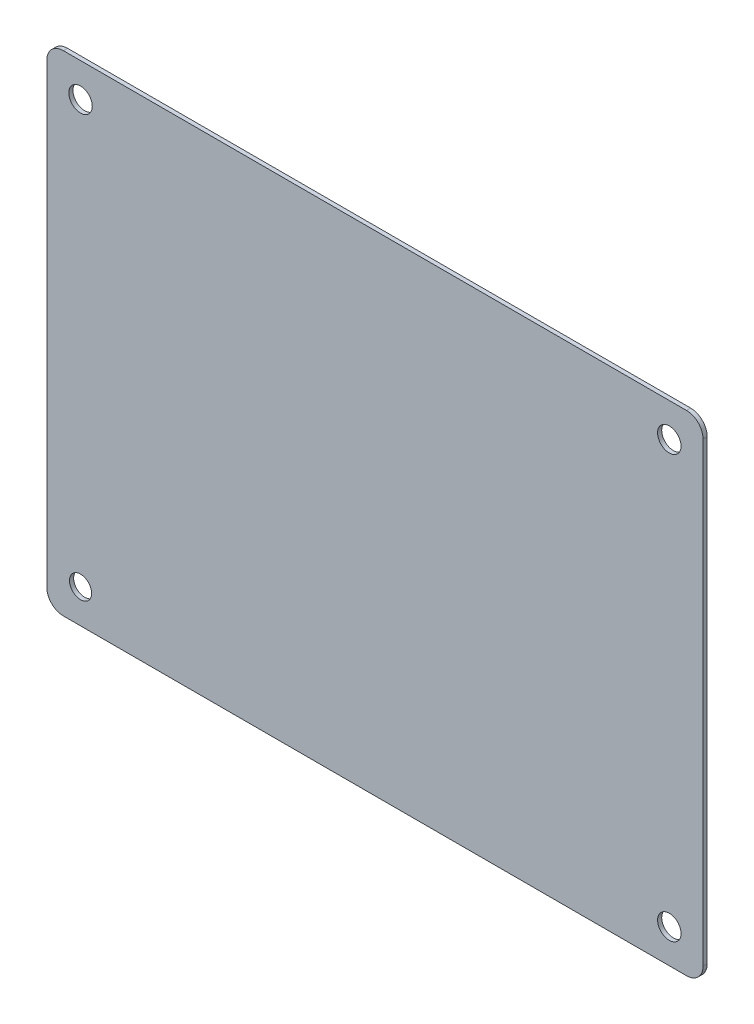
ISO-10303-21;
HEADER;
FILE_DESCRIPTION(('STEP AP214'),'2;1');
FILE_NAME('part.step','',(''),(''),'','','');
FILE_SCHEMA(('AUTOMOTIVE_DESIGN { 1 0 10303 214 1 1 1 1 }'));
ENDSEC;
DATA;
#1=APPLICATION_CONTEXT('core data for automotive mechanical design processes');
#2=APPLICATION_PROTOCOL_DEFINITION('international standard','automotive_design',2000,#1);
#3=PRODUCT_CONTEXT('',#1,'mechanical');
#4=PRODUCT('Part','Part','',(#3));
#5=PRODUCT_RELATED_PRODUCT_CATEGORY('part','',(#4));
#6=PRODUCT_DEFINITION_FORMATION('','',#4);
#7=PRODUCT_DEFINITION_CONTEXT('part definition',#1,'design');
#8=PRODUCT_DEFINITION('design','',#6,#7);
#9=PRODUCT_DEFINITION_SHAPE('','',#8);
#10=(LENGTH_UNIT() NAMED_UNIT(*) SI_UNIT(.MILLI.,.METRE.));
#11=(NAMED_UNIT(*) PLANE_ANGLE_UNIT() SI_UNIT($,.RADIAN.));
#12=(NAMED_UNIT(*) SI_UNIT($,.STERADIAN.) SOLID_ANGLE_UNIT());
#13=UNCERTAINTY_MEASURE_WITH_UNIT(LENGTH_MEASURE(1.E-05),#10,'distance_accuracy_value','');
#14=(GEOMETRIC_REPRESENTATION_CONTEXT(3) GLOBAL_UNCERTAINTY_ASSIGNED_CONTEXT((#13)) GLOBAL_UNIT_ASSIGNED_CONTEXT((#10,
#11,#12)) REPRESENTATION_CONTEXT('',''));
#15=CARTESIAN_POINT('',(0.,0.,0.));
#16=DIRECTION('',(0.,0.,1.));
#17=DIRECTION('',(1.,0.,0.));
#18=AXIS2_PLACEMENT_3D('',#15,#16,#17);
#19=CARTESIAN_POINT('',(403.918477617986,1244.64155346518,1.5875));
#20=DIRECTION('',(0.,0.,-1.));
#21=DIRECTION('',(-1.,0.,0.));
#22=AXIS2_PLACEMENT_3D('',#19,#20,#21);
#23=PLANE('',#22);
#24=CARTESIAN_POINT('',(403.918477617986,1244.64155346518,1.5875));
#25=DIRECTION('',(0.,0.,1.));
#26=DIRECTION('',(-1.,0.,0.));
#27=AXIS2_PLACEMENT_3D('',#24,#25,#26);
#28=CIRCLE('',#27,6.35000000000005);
#29=CARTESIAN_POINT('',(397.568477617986,1244.64155346518,1.5875));
#30=VERTEX_POINT('',#29);
#31=CARTESIAN_POINT('',(403.918477617986,1238.29155346518,1.5875));
#32=VERTEX_POINT('',#31);
#33=EDGE_CURVE('E170',#30,#32,#28,.T.);
#34=ORIENTED_EDGE('',*,*,#33,.T.);
#35=DIRECTION('',(1.,0.,0.));
#36=VECTOR('',#35,1.);
#37=CARTESIAN_POINT('',(403.918477617986,1238.29155346518,1.5875));
#38=LINE('',#37,#36);
#39=CARTESIAN_POINT('',(643.139919853278,1238.29155346518,1.5875));
#40=VERTEX_POINT('',#39);
#41=EDGE_CURVE('E106',#32,#40,#38,.T.);
#42=ORIENTED_EDGE('',*,*,#41,.T.);
#43=CARTESIAN_POINT('',(643.139919853278,1244.64155346518,1.5875));
#44=DIRECTION('',(0.,0.,1.));
#45=DIRECTION('',(1.,0.,0.));
#46=AXIS2_PLACEMENT_3D('',#43,#44,#45);
#47=CIRCLE('',#46,6.35000000000002);
#48=CARTESIAN_POINT('',(649.489919853278,1244.64155346518,1.5875));
#49=VERTEX_POINT('',#48);
#50=EDGE_CURVE('E191',#40,#49,#47,.T.);
#51=ORIENTED_EDGE('',*,*,#50,.T.);
#52=DIRECTION('',(0.,1.,0.));
#53=VECTOR('',#52,1.);
#54=CARTESIAN_POINT('',(649.489919853278,1244.64155346518,1.5875));
#55=LINE('',#54,#53);
#56=CARTESIAN_POINT('',(649.489919853278,1419.86299570047,1.5875));
#57=VERTEX_POINT('',#56);
#58=EDGE_CURVE('E205',#49,#57,#55,.T.);
#59=ORIENTED_EDGE('',*,*,#58,.T.);
#60=CARTESIAN_POINT('',(643.139919853278,1419.86299570047,1.5875));
#61=DIRECTION('',(0.,0.,1.));
#62=DIRECTION('',(-1.,0.,0.));
#63=AXIS2_PLACEMENT_3D('',#60,#61,#62);
#64=CIRCLE('',#63,6.35000000000002);
#65=CARTESIAN_POINT('',(643.139919853278,1426.21299570047,1.5875));
#66=VERTEX_POINT('',#65);
#67=EDGE_CURVE('E125',#57,#66,#64,.T.);
#68=ORIENTED_EDGE('',*,*,#67,.T.);
#69=DIRECTION('',(-1.,0.,0.));
#70=VECTOR('',#69,1.);
#71=CARTESIAN_POINT('',(403.918477617986,1426.21299570047,1.5875));
#72=LINE('',#71,#70);
#73=CARTESIAN_POINT('',(403.918477617986,1426.21299570047,1.5875));
#74=VERTEX_POINT('',#73);
#75=EDGE_CURVE('E119',#66,#74,#72,.T.);
#76=ORIENTED_EDGE('',*,*,#75,.T.);
#77=CARTESIAN_POINT('',(403.918477617986,1419.86299570047,1.5875));
#78=DIRECTION('',(0.,0.,1.));
#79=DIRECTION('',(-1.,0.,0.));
#80=AXIS2_PLACEMENT_3D('',#77,#78,#79);
#81=CIRCLE('',#80,6.35000000000005);
#82=CARTESIAN_POINT('',(397.568477617986,1419.86299570047,1.5875));
#83=VERTEX_POINT('',#82);
#84=EDGE_CURVE('E123',#74,#83,#81,.T.);
#85=ORIENTED_EDGE('',*,*,#84,.T.);
#86=DIRECTION('',(0.,-1.,0.));
#87=VECTOR('',#86,1.);
#88=CARTESIAN_POINT('',(397.568477617986,1244.64155346518,1.5875));
#89=LINE('',#88,#87);
#90=EDGE_CURVE('E63',#83,#30,#89,.T.);
#91=ORIENTED_EDGE('',*,*,#90,.T.);
#92=EDGE_LOOP('',(#34,#42,#51,#59,#68,#76,#85,#91));
#93=FACE_BOUND('',#92,.T.);
#94=CARTESIAN_POINT('',(636.529198735632,1413.25227458283,1.5875));
#95=DIRECTION('',(0.,0.,1.));
#96=DIRECTION('',(1.,0.,0.));
#97=AXIS2_PLACEMENT_3D('',#94,#95,#96);
#98=CIRCLE('',#97,4.49999999999978);
#99=CARTESIAN_POINT('',(641.029198735631,1413.25227458283,1.5875));
#100=VERTEX_POINT('',#99);
#101=EDGE_CURVE('E152',#100,#100,#98,.T.);
#102=ORIENTED_EDGE('',*,*,#101,.F.);
#103=EDGE_LOOP('',(#102));
#104=FACE_BOUND('',#103,.T.);
#105=CARTESIAN_POINT('',(410.529198735632,1413.25227458283,1.5875));
#106=DIRECTION('',(0.,0.,1.));
#107=DIRECTION('',(1.,0.,0.));
#108=AXIS2_PLACEMENT_3D('',#105,#106,#107);
#109=CIRCLE('',#108,4.49999999999988);
#110=CARTESIAN_POINT('',(415.029198735632,1413.25227458283,1.5875));
#111=VERTEX_POINT('',#110);
#112=EDGE_CURVE('E219',#111,#111,#109,.T.);
#113=ORIENTED_EDGE('',*,*,#112,.F.);
#114=EDGE_LOOP('',(#113));
#115=FACE_BOUND('',#114,.T.);
#116=CARTESIAN_POINT('',(636.529198735632,1251.25227458283,1.5875));
#117=DIRECTION('',(0.,0.,1.));
#118=DIRECTION('',(1.,0.,0.));
#119=AXIS2_PLACEMENT_3D('',#116,#117,#118);
#120=CIRCLE('',#119,4.49999999999978);
#121=CARTESIAN_POINT('',(641.029198735632,1251.25227458283,1.5875));
#122=VERTEX_POINT('',#121);
#123=EDGE_CURVE('E227',#122,#122,#120,.T.);
#124=ORIENTED_EDGE('',*,*,#123,.F.);
#125=EDGE_LOOP('',(#124));
#126=FACE_BOUND('',#125,.T.);
#127=CARTESIAN_POINT('',(410.529198735632,1251.25227458283,1.5875));
#128=DIRECTION('',(0.,0.,1.));
#129=DIRECTION('',(1.,0.,0.));
#130=AXIS2_PLACEMENT_3D('',#127,#128,#129);
#131=CIRCLE('',#130,4.25000000000002);
#132=CARTESIAN_POINT('',(414.779198735632,1251.25227458283,1.5875));
#133=VERTEX_POINT('',#132);
#134=EDGE_CURVE('E235',#133,#133,#131,.T.);
#135=ORIENTED_EDGE('',*,*,#134,.F.);
#136=EDGE_LOOP('',(#135));
#137=FACE_BOUND('',#136,.T.);
#138=ADVANCED_FACE('F45',(#93,#104,#115,#126,#137),#23,.F.);
#139=CARTESIAN_POINT('',(403.918477617986,1244.64155346518,0.));
#140=DIRECTION('',(0.,0.,-1.));
#141=DIRECTION('',(-1.,0.,0.));
#142=AXIS2_PLACEMENT_3D('',#139,#140,#141);
#143=PLANE('',#142);
#144=CARTESIAN_POINT('',(636.529198735632,1251.25227458283,0.));
#145=DIRECTION('',(0.,0.,1.));
#146=DIRECTION('',(1.,0.,0.));
#147=AXIS2_PLACEMENT_3D('',#144,#145,#146);
#148=CIRCLE('',#147,4.49999999999978);
#149=CARTESIAN_POINT('',(641.029198735632,1251.25227458283,0.));
#150=VERTEX_POINT('',#149);
#151=EDGE_CURVE('E231',#150,#150,#148,.T.);
#152=ORIENTED_EDGE('',*,*,#151,.T.);
#153=EDGE_LOOP('',(#152));
#154=FACE_BOUND('',#153,.T.);
#155=CARTESIAN_POINT('',(636.529198735632,1413.25227458283,0.));
#156=DIRECTION('',(0.,0.,1.));
#157=DIRECTION('',(1.,0.,0.));
#158=AXIS2_PLACEMENT_3D('',#155,#156,#157);
#159=CIRCLE('',#158,4.49999999999978);
#160=CARTESIAN_POINT('',(641.029198735631,1413.25227458283,0.));
#161=VERTEX_POINT('',#160);
#162=EDGE_CURVE('E215',#161,#161,#159,.T.);
#163=ORIENTED_EDGE('',*,*,#162,.T.);
#164=EDGE_LOOP('',(#163));
#165=FACE_BOUND('',#164,.T.);
#166=CARTESIAN_POINT('',(403.918477617986,1244.64155346518,0.));
#167=DIRECTION('',(0.,0.,1.));
#168=DIRECTION('',(-1.,0.,0.));
#169=AXIS2_PLACEMENT_3D('',#166,#167,#168);
#170=CIRCLE('',#169,6.35000000000005);
#171=CARTESIAN_POINT('',(397.568477617986,1244.64155346518,0.));
#172=VERTEX_POINT('',#171);
#173=CARTESIAN_POINT('',(403.918477617986,1238.29155346518,0.));
#174=VERTEX_POINT('',#173);
#175=EDGE_CURVE('E147',#172,#174,#170,.T.);
#176=ORIENTED_EDGE('',*,*,#175,.F.);
#177=DIRECTION('',(0.,-1.,0.));
#178=VECTOR('',#177,1.);
#179=CARTESIAN_POINT('',(397.568477617986,1244.64155346518,0.));
#180=LINE('',#179,#178);
#181=CARTESIAN_POINT('',(397.568477617986,1419.86299570047,0.));
#182=VERTEX_POINT('',#181);
#183=EDGE_CURVE('E98',#182,#172,#180,.T.);
#184=ORIENTED_EDGE('',*,*,#183,.F.);
#185=CARTESIAN_POINT('',(403.918477617986,1419.86299570047,0.));
#186=DIRECTION('',(0.,0.,1.));
#187=DIRECTION('',(-1.,0.,0.));
#188=AXIS2_PLACEMENT_3D('',#185,#186,#187);
#189=CIRCLE('',#188,6.35000000000005);
#190=CARTESIAN_POINT('',(403.918477617986,1426.21299570047,0.));
#191=VERTEX_POINT('',#190);
#192=EDGE_CURVE('E92',#191,#182,#189,.T.);
#193=ORIENTED_EDGE('',*,*,#192,.F.);
#194=DIRECTION('',(-1.,0.,0.));
#195=VECTOR('',#194,1.);
#196=CARTESIAN_POINT('',(403.918477617986,1426.21299570047,0.));
#197=LINE('',#196,#195);
#198=CARTESIAN_POINT('',(643.139919853278,1426.21299570047,0.));
#199=VERTEX_POINT('',#198);
#200=EDGE_CURVE('E134',#199,#191,#197,.T.);
#201=ORIENTED_EDGE('',*,*,#200,.F.);
#202=CARTESIAN_POINT('',(643.139919853278,1419.86299570047,0.));
#203=DIRECTION('',(0.,0.,1.));
#204=DIRECTION('',(-1.,0.,0.));
#205=AXIS2_PLACEMENT_3D('',#202,#203,#204);
#206=CIRCLE('',#205,6.35000000000002);
#207=CARTESIAN_POINT('',(649.489919853278,1419.86299570047,0.));
#208=VERTEX_POINT('',#207);
#209=EDGE_CURVE('E161',#208,#199,#206,.T.);
#210=ORIENTED_EDGE('',*,*,#209,.F.);
#211=DIRECTION('',(0.,1.,0.));
#212=VECTOR('',#211,1.);
#213=CARTESIAN_POINT('',(649.489919853278,1244.64155346518,0.));
#214=LINE('',#213,#212);
#215=CARTESIAN_POINT('',(649.489919853278,1244.64155346518,0.));
#216=VERTEX_POINT('',#215);
#217=EDGE_CURVE('E158',#216,#208,#214,.T.);
#218=ORIENTED_EDGE('',*,*,#217,.F.);
#219=CARTESIAN_POINT('',(643.139919853278,1244.64155346518,0.));
#220=DIRECTION('',(0.,0.,1.));
#221=DIRECTION('',(1.,0.,0.));
#222=AXIS2_PLACEMENT_3D('',#219,#220,#221);
#223=CIRCLE('',#222,6.35000000000002);
#224=CARTESIAN_POINT('',(643.139919853278,1238.29155346518,0.));
#225=VERTEX_POINT('',#224);
#226=EDGE_CURVE('E155',#225,#216,#223,.T.);
#227=ORIENTED_EDGE('',*,*,#226,.F.);
#228=DIRECTION('',(1.,0.,0.));
#229=VECTOR('',#228,1.);
#230=CARTESIAN_POINT('',(403.918477617986,1238.29155346518,0.));
#231=LINE('',#230,#229);
#232=EDGE_CURVE('E151',#174,#225,#231,.T.);
#233=ORIENTED_EDGE('',*,*,#232,.F.);
#234=EDGE_LOOP('',(#176,#184,#193,#201,#210,#218,#227,#233));
#235=FACE_BOUND('',#234,.T.);
#236=CARTESIAN_POINT('',(410.529198735632,1413.25227458283,0.));
#237=DIRECTION('',(0.,0.,1.));
#238=DIRECTION('',(1.,0.,0.));
#239=AXIS2_PLACEMENT_3D('',#236,#237,#238);
#240=CIRCLE('',#239,4.49999999999988);
#241=CARTESIAN_POINT('',(415.029198735632,1413.25227458283,0.));
#242=VERTEX_POINT('',#241);
#243=EDGE_CURVE('E223',#242,#242,#240,.T.);
#244=ORIENTED_EDGE('',*,*,#243,.T.);
#245=EDGE_LOOP('',(#244));
#246=FACE_BOUND('',#245,.T.);
#247=CARTESIAN_POINT('',(410.529198735632,1251.25227458283,0.));
#248=DIRECTION('',(0.,0.,1.));
#249=DIRECTION('',(1.,0.,0.));
#250=AXIS2_PLACEMENT_3D('',#247,#248,#249);
#251=CIRCLE('',#250,4.25000000000002);
#252=CARTESIAN_POINT('',(414.779198735632,1251.25227458283,0.));
#253=VERTEX_POINT('',#252);
#254=EDGE_CURVE('E239',#253,#253,#251,.T.);
#255=ORIENTED_EDGE('',*,*,#254,.T.);
#256=EDGE_LOOP('',(#255));
#257=FACE_BOUND('',#256,.T.);
#258=ADVANCED_FACE('F195',(#154,#165,#235,#246,#257),#143,.T.);
#259=CARTESIAN_POINT('',(403.918477617986,1244.64155346518,1.5875));
#260=DIRECTION('',(0.,0.,-1.));
#261=DIRECTION('',(-1.,0.,0.));
#262=AXIS2_PLACEMENT_3D('',#259,#260,#261);
#263=CYLINDRICAL_SURFACE('',#262,6.35000000000005);
#264=ORIENTED_EDGE('',*,*,#175,.T.);
#265=DIRECTION('',(0.,0.,-1.));
#266=VECTOR('',#265,1.);
#267=CARTESIAN_POINT('',(403.918477617986,1238.29155346518,1.5875));
#268=LINE('',#267,#266);
#269=EDGE_CURVE('E11',#32,#174,#268,.T.);
#270=ORIENTED_EDGE('',*,*,#269,.F.);
#271=ORIENTED_EDGE('',*,*,#33,.F.);
#272=DIRECTION('',(0.,0.,-1.));
#273=VECTOR('',#272,1.);
#274=CARTESIAN_POINT('',(397.568477617986,1244.64155346518,1.5875));
#275=LINE('',#274,#273);
#276=EDGE_CURVE('E143',#30,#172,#275,.T.);
#277=ORIENTED_EDGE('',*,*,#276,.T.);
#278=EDGE_LOOP('',(#264,#270,#271,#277));
#279=FACE_BOUND('',#278,.T.);
#280=ADVANCED_FACE('F47',(#279),#263,.T.);
#281=CARTESIAN_POINT('',(403.918477617986,1238.29155346518,1.5875));
#282=DIRECTION('',(0.,1.,0.));
#283=DIRECTION('',(0.,0.,1.));
#284=AXIS2_PLACEMENT_3D('',#281,#282,#283);
#285=PLANE('',#284);
#286=ORIENTED_EDGE('',*,*,#232,.T.);
#287=DIRECTION('',(0.,0.,-1.));
#288=VECTOR('',#287,1.);
#289=CARTESIAN_POINT('',(643.139919853278,1238.29155346518,1.5875));
#290=LINE('',#289,#288);
#291=EDGE_CURVE('E55',#40,#225,#290,.T.);
#292=ORIENTED_EDGE('',*,*,#291,.F.);
#293=ORIENTED_EDGE('',*,*,#41,.F.);
#294=ORIENTED_EDGE('',*,*,#269,.T.);
#295=EDGE_LOOP('',(#286,#292,#293,#294));
#296=FACE_BOUND('',#295,.T.);
#297=ADVANCED_FACE('F273',(#296),#285,.F.);
#298=CARTESIAN_POINT('',(643.139919853278,1244.64155346518,1.5875));
#299=DIRECTION('',(0.,0.,-1.));
#300=DIRECTION('',(-1.,0.,0.));
#301=AXIS2_PLACEMENT_3D('',#298,#299,#300);
#302=CYLINDRICAL_SURFACE('',#301,6.35000000000002);
#303=ORIENTED_EDGE('',*,*,#226,.T.);
#304=DIRECTION('',(0.,0.,-1.));
#305=VECTOR('',#304,1.);
#306=CARTESIAN_POINT('',(649.489919853278,1244.64155346518,1.5875));
#307=LINE('',#306,#305);
#308=EDGE_CURVE('E181',#49,#216,#307,.T.);
#309=ORIENTED_EDGE('',*,*,#308,.F.);
#310=ORIENTED_EDGE('',*,*,#50,.F.);
#311=ORIENTED_EDGE('',*,*,#291,.T.);
#312=EDGE_LOOP('',(#303,#309,#310,#311));
#313=FACE_BOUND('',#312,.T.);
#314=ADVANCED_FACE('F189',(#313),#302,.T.);
#315=CARTESIAN_POINT('',(649.489919853278,1244.64155346518,1.5875));
#316=DIRECTION('',(-1.,0.,0.));
#317=DIRECTION('',(0.,0.,1.));
#318=AXIS2_PLACEMENT_3D('',#315,#316,#317);
#319=PLANE('',#318);
#320=ORIENTED_EDGE('',*,*,#217,.T.);
#321=DIRECTION('',(0.,0.,-1.));
#322=VECTOR('',#321,1.);
#323=CARTESIAN_POINT('',(649.489919853278,1419.86299570047,1.5875));
#324=LINE('',#323,#322);
#325=EDGE_CURVE('E177',#57,#208,#324,.T.);
#326=ORIENTED_EDGE('',*,*,#325,.F.);
#327=ORIENTED_EDGE('',*,*,#58,.F.);
#328=ORIENTED_EDGE('',*,*,#308,.T.);
#329=EDGE_LOOP('',(#320,#326,#327,#328));
#330=FACE_BOUND('',#329,.T.);
#331=ADVANCED_FACE('F200',(#330),#319,.F.);
#332=CARTESIAN_POINT('',(643.139919853278,1419.86299570047,1.5875));
#333=DIRECTION('',(0.,0.,-1.));
#334=DIRECTION('',(-1.,0.,0.));
#335=AXIS2_PLACEMENT_3D('',#332,#333,#334);
#336=CYLINDRICAL_SURFACE('',#335,6.35000000000002);
#337=ORIENTED_EDGE('',*,*,#209,.T.);
#338=DIRECTION('',(0.,0.,-1.));
#339=VECTOR('',#338,1.);
#340=CARTESIAN_POINT('',(643.139919853278,1426.21299570047,1.5875));
#341=LINE('',#340,#339);
#342=EDGE_CURVE('E136',#66,#199,#341,.T.);
#343=ORIENTED_EDGE('',*,*,#342,.F.);
#344=ORIENTED_EDGE('',*,*,#67,.F.);
#345=ORIENTED_EDGE('',*,*,#325,.T.);
#346=EDGE_LOOP('',(#337,#343,#344,#345));
#347=FACE_BOUND('',#346,.T.);
#348=ADVANCED_FACE('F203',(#347),#336,.T.);
#349=CARTESIAN_POINT('',(403.918477617986,1426.21299570047,1.5875));
#350=DIRECTION('',(0.,-1.,0.));
#351=DIRECTION('',(0.,0.,-1.));
#352=AXIS2_PLACEMENT_3D('',#349,#350,#351);
#353=PLANE('',#352);
#354=ORIENTED_EDGE('',*,*,#200,.T.);
#355=DIRECTION('',(0.,0.,-1.));
#356=VECTOR('',#355,1.);
#357=CARTESIAN_POINT('',(403.918477617986,1426.21299570047,1.5875));
#358=LINE('',#357,#356);
#359=EDGE_CURVE('E131',#74,#191,#358,.T.);
#360=ORIENTED_EDGE('',*,*,#359,.F.);
#361=ORIENTED_EDGE('',*,*,#75,.F.);
#362=ORIENTED_EDGE('',*,*,#342,.T.);
#363=EDGE_LOOP('',(#354,#360,#361,#362));
#364=FACE_BOUND('',#363,.T.);
#365=ADVANCED_FACE('F132',(#364),#353,.F.);
#366=CARTESIAN_POINT('',(403.918477617986,1419.86299570047,1.5875));
#367=DIRECTION('',(0.,0.,-1.));
#368=DIRECTION('',(-1.,0.,0.));
#369=AXIS2_PLACEMENT_3D('',#366,#367,#368);
#370=CYLINDRICAL_SURFACE('',#369,6.35000000000005);
#371=ORIENTED_EDGE('',*,*,#192,.T.);
#372=DIRECTION('',(0.,0.,-1.));
#373=VECTOR('',#372,1.);
#374=CARTESIAN_POINT('',(397.568477617986,1419.86299570047,1.5875));
#375=LINE('',#374,#373);
#376=EDGE_CURVE('E137',#83,#182,#375,.T.);
#377=ORIENTED_EDGE('',*,*,#376,.F.);
#378=ORIENTED_EDGE('',*,*,#84,.F.);
#379=ORIENTED_EDGE('',*,*,#359,.T.);
#380=EDGE_LOOP('',(#371,#377,#378,#379));
#381=FACE_BOUND('',#380,.T.);
#382=ADVANCED_FACE('F139',(#381),#370,.T.);
#383=CARTESIAN_POINT('',(397.568477617986,1244.64155346518,1.5875));
#384=DIRECTION('',(1.,0.,0.));
#385=DIRECTION('',(0.,0.,-1.));
#386=AXIS2_PLACEMENT_3D('',#383,#384,#385);
#387=PLANE('',#386);
#388=ORIENTED_EDGE('',*,*,#183,.T.);
#389=ORIENTED_EDGE('',*,*,#276,.F.);
#390=ORIENTED_EDGE('',*,*,#90,.F.);
#391=ORIENTED_EDGE('',*,*,#376,.T.);
#392=EDGE_LOOP('',(#388,#389,#390,#391));
#393=FACE_BOUND('',#392,.T.);
#394=ADVANCED_FACE('F261',(#393),#387,.F.);
#395=CARTESIAN_POINT('',(636.529198735632,1413.25227458283,1.5875));
#396=DIRECTION('',(0.,0.,-1.));
#397=DIRECTION('',(-1.,0.,0.));
#398=AXIS2_PLACEMENT_3D('',#395,#396,#397);
#399=CYLINDRICAL_SURFACE('',#398,4.49999999999978);
#400=ORIENTED_EDGE('',*,*,#101,.T.);
#401=EDGE_LOOP('',(#400));
#402=FACE_BOUND('',#401,.T.);
#403=ORIENTED_EDGE('',*,*,#162,.F.);
#404=EDGE_LOOP('',(#403));
#405=FACE_BOUND('',#404,.T.);
#406=ADVANCED_FACE('F258',(#402,#405),#399,.F.);
#407=CARTESIAN_POINT('',(410.529198735632,1413.25227458283,1.5875));
#408=DIRECTION('',(0.,0.,-1.));
#409=DIRECTION('',(-1.,0.,0.));
#410=AXIS2_PLACEMENT_3D('',#407,#408,#409);
#411=CYLINDRICAL_SURFACE('',#410,4.49999999999988);
#412=ORIENTED_EDGE('',*,*,#112,.T.);
#413=EDGE_LOOP('',(#412));
#414=FACE_BOUND('',#413,.T.);
#415=ORIENTED_EDGE('',*,*,#243,.F.);
#416=EDGE_LOOP('',(#415));
#417=FACE_BOUND('',#416,.T.);
#418=ADVANCED_FACE('F336',(#414,#417),#411,.F.);
#419=CARTESIAN_POINT('',(636.529198735632,1251.25227458283,1.5875));
#420=DIRECTION('',(0.,0.,-1.));
#421=DIRECTION('',(-1.,0.,0.));
#422=AXIS2_PLACEMENT_3D('',#419,#420,#421);
#423=CYLINDRICAL_SURFACE('',#422,4.49999999999978);
#424=ORIENTED_EDGE('',*,*,#123,.T.);
#425=EDGE_LOOP('',(#424));
#426=FACE_BOUND('',#425,.T.);
#427=ORIENTED_EDGE('',*,*,#151,.F.);
#428=EDGE_LOOP('',(#427));
#429=FACE_BOUND('',#428,.T.);
#430=ADVANCED_FACE('F344',(#426,#429),#423,.F.);
#431=CARTESIAN_POINT('',(410.529198735632,1251.25227458283,1.5875));
#432=DIRECTION('',(0.,0.,-1.));
#433=DIRECTION('',(-1.,0.,0.));
#434=AXIS2_PLACEMENT_3D('',#431,#432,#433);
#435=CYLINDRICAL_SURFACE('',#434,4.25000000000002);
#436=ORIENTED_EDGE('',*,*,#134,.T.);
#437=EDGE_LOOP('',(#436));
#438=FACE_BOUND('',#437,.T.);
#439=ORIENTED_EDGE('',*,*,#254,.F.);
#440=EDGE_LOOP('',(#439));
#441=FACE_BOUND('',#440,.T.);
#442=ADVANCED_FACE('F247',(#438,#441),#435,.F.);
#443=CLOSED_SHELL('',(#138,#258,#280,#297,#314,#331,#348,#365,#382,#394,#406,#418,#430,#442));
#444=MANIFOLD_SOLID_BREP('B2',#443);
#445=ADVANCED_BREP_SHAPE_REPRESENTATION('',(#18,#444),#14);
#446=SHAPE_DEFINITION_REPRESENTATION(#9,#445);
ENDSEC;
END-ISO-10303-21;
